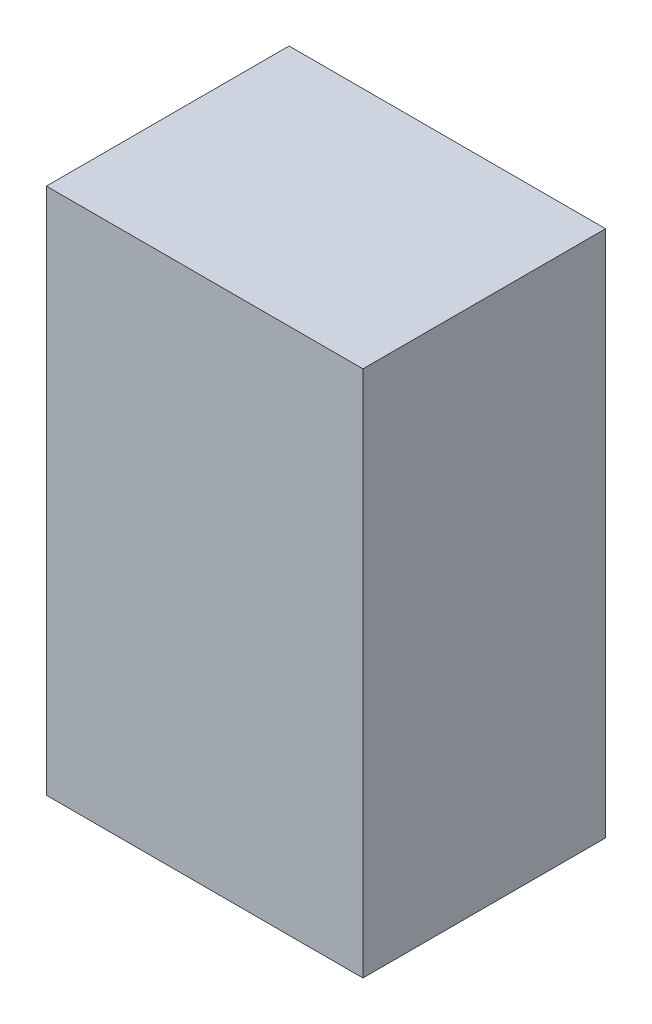
ISO-10303-21;
HEADER;
FILE_DESCRIPTION(('STEP AP214'),'2;1');
FILE_NAME('part.step','',(''),(''),'','','');
FILE_SCHEMA(('AUTOMOTIVE_DESIGN { 1 0 10303 214 1 1 1 1 }'));
ENDSEC;
DATA;
#1=APPLICATION_CONTEXT('core data for automotive mechanical design processes');
#2=APPLICATION_PROTOCOL_DEFINITION('international standard','automotive_design',2000,#1);
#3=PRODUCT_CONTEXT('',#1,'mechanical');
#4=PRODUCT('Part','Part','',(#3));
#5=PRODUCT_RELATED_PRODUCT_CATEGORY('part','',(#4));
#6=PRODUCT_DEFINITION_FORMATION('','',#4);
#7=PRODUCT_DEFINITION_CONTEXT('part definition',#1,'design');
#8=PRODUCT_DEFINITION('design','',#6,#7);
#9=PRODUCT_DEFINITION_SHAPE('','',#8);
#10=(LENGTH_UNIT() NAMED_UNIT(*) SI_UNIT(.MILLI.,.METRE.));
#11=(NAMED_UNIT(*) PLANE_ANGLE_UNIT() SI_UNIT($,.RADIAN.));
#12=(NAMED_UNIT(*) SI_UNIT($,.STERADIAN.) SOLID_ANGLE_UNIT());
#13=UNCERTAINTY_MEASURE_WITH_UNIT(LENGTH_MEASURE(1.E-05),#10,'distance_accuracy_value','');
#14=(GEOMETRIC_REPRESENTATION_CONTEXT(3) GLOBAL_UNCERTAINTY_ASSIGNED_CONTEXT((#13)) GLOBAL_UNIT_ASSIGNED_CONTEXT((#10,
#11,#12)) REPRESENTATION_CONTEXT('',''));
#15=CARTESIAN_POINT('',(0.,0.,0.));
#16=DIRECTION('',(0.,0.,1.));
#17=DIRECTION('',(1.,0.,0.));
#18=AXIS2_PLACEMENT_3D('',#15,#16,#17);
#19=CARTESIAN_POINT('',(0.,25.,0.));
#20=DIRECTION('',(0.,1.,0.));
#21=DIRECTION('',(0.,0.,1.));
#22=AXIS2_PLACEMENT_3D('',#19,#20,#21);
#23=PLANE('',#22);
#24=DIRECTION('',(0.,0.,-1.));
#25=VECTOR('',#24,1.);
#26=CARTESIAN_POINT('',(12.5,25.,0.));
#27=LINE('',#26,#25);
#28=CARTESIAN_POINT('',(12.5,25.,3.99999999999999));
#29=VERTEX_POINT('',#28);
#30=CARTESIAN_POINT('',(12.5,25.,-9.));
#31=VERTEX_POINT('',#30);
#32=EDGE_CURVE('E145',#29,#31,#27,.T.);
#33=ORIENTED_EDGE('',*,*,#32,.F.);
#34=DIRECTION('',(-1.,0.,0.));
#35=VECTOR('',#34,1.);
#36=CARTESIAN_POINT('',(12.5,25.,3.99999999999999));
#37=LINE('',#36,#35);
#38=CARTESIAN_POINT('',(1.5,25.,3.99999999999999));
#39=VERTEX_POINT('',#38);
#40=EDGE_CURVE('E150',#29,#39,#37,.T.);
#41=ORIENTED_EDGE('',*,*,#40,.T.);
#42=CARTESIAN_POINT('',(0.,25.,6.));
#43=DIRECTION('',(0.,1.,0.));
#44=DIRECTION('',(0.,0.,1.));
#45=AXIS2_PLACEMENT_3D('',#42,#43,#44);
#46=CIRCLE('',#45,2.5);
#47=CARTESIAN_POINT('',(-1.5,25.,3.99999999999999));
#48=VERTEX_POINT('',#47);
#49=EDGE_CURVE('E164',#48,#39,#46,.F.);
#50=ORIENTED_EDGE('',*,*,#49,.F.);
#51=CARTESIAN_POINT('',(-12.5,25.,4.));
#52=VERTEX_POINT('',#51);
#53=EDGE_CURVE('E158',#48,#52,#37,.T.);
#54=ORIENTED_EDGE('',*,*,#53,.T.);
#55=DIRECTION('',(0.,0.,-1.));
#56=VECTOR('',#55,1.);
#57=CARTESIAN_POINT('',(-12.5,25.,0.));
#58=LINE('',#57,#56);
#59=CARTESIAN_POINT('',(-12.5,25.,-9.));
#60=VERTEX_POINT('',#59);
#61=EDGE_CURVE('E54',#52,#60,#58,.T.);
#62=ORIENTED_EDGE('',*,*,#61,.T.);
#63=DIRECTION('',(1.,0.,0.));
#64=VECTOR('',#63,1.);
#65=CARTESIAN_POINT('',(0.,25.,-9.));
#66=LINE('',#65,#64);
#67=EDGE_CURVE('E160',#60,#31,#66,.T.);
#68=ORIENTED_EDGE('',*,*,#67,.T.);
#69=EDGE_LOOP('',(#33,#41,#50,#54,#62,#68));
#70=FACE_BOUND('',#69,.T.);
#71=ADVANCED_FACE('F39',(#70),#23,.F.);
#72=CARTESIAN_POINT('',(0.,2.5,0.));
#73=DIRECTION('',(0.,1.,0.));
#74=DIRECTION('',(0.,0.,1.));
#75=AXIS2_PLACEMENT_3D('',#72,#73,#74);
#76=PLANE('',#75);
#77=CARTESIAN_POINT('',(0.,2.5,6.));
#78=DIRECTION('',(0.,1.,0.));
#79=DIRECTION('',(0.,0.,1.));
#80=AXIS2_PLACEMENT_3D('',#77,#78,#79);
#81=CIRCLE('',#80,2.5);
#82=CARTESIAN_POINT('',(0.,2.5,8.5));
#83=VERTEX_POINT('',#82);
#84=EDGE_CURVE('E232',#83,#83,#81,.F.);
#85=ORIENTED_EDGE('',*,*,#84,.T.);
#86=EDGE_LOOP('',(#85));
#87=FACE_BOUND('',#86,.T.);
#88=DIRECTION('',(0.,0.,-1.));
#89=VECTOR('',#88,1.);
#90=CARTESIAN_POINT('',(-12.5,2.5,0.));
#91=LINE('',#90,#89);
#92=CARTESIAN_POINT('',(-12.5,2.5,9.));
#93=VERTEX_POINT('',#92);
#94=CARTESIAN_POINT('',(-12.5,2.5,-9.));
#95=VERTEX_POINT('',#94);
#96=EDGE_CURVE('E180',#93,#95,#91,.T.);
#97=ORIENTED_EDGE('',*,*,#96,.F.);
#98=DIRECTION('',(1.,0.,0.));
#99=VECTOR('',#98,1.);
#100=CARTESIAN_POINT('',(0.,2.5,9.));
#101=LINE('',#100,#99);
#102=CARTESIAN_POINT('',(12.5,2.5,9.));
#103=VERTEX_POINT('',#102);
#104=EDGE_CURVE('E183',#93,#103,#101,.T.);
#105=ORIENTED_EDGE('',*,*,#104,.T.);
#106=DIRECTION('',(0.,0.,-1.));
#107=VECTOR('',#106,1.);
#108=CARTESIAN_POINT('',(12.5,2.5,0.));
#109=LINE('',#108,#107);
#110=CARTESIAN_POINT('',(12.5,2.5,-9.));
#111=VERTEX_POINT('',#110);
#112=EDGE_CURVE('E187',#103,#111,#109,.T.);
#113=ORIENTED_EDGE('',*,*,#112,.T.);
#114=DIRECTION('',(1.,0.,0.));
#115=VECTOR('',#114,1.);
#116=CARTESIAN_POINT('',(0.,2.5,-9.));
#117=LINE('',#116,#115);
#118=EDGE_CURVE('E172',#95,#111,#117,.T.);
#119=ORIENTED_EDGE('',*,*,#118,.F.);
#120=EDGE_LOOP('',(#97,#105,#113,#119));
#121=FACE_BOUND('',#120,.T.);
#122=ADVANCED_FACE('F278',(#87,#121),#76,.T.);
#123=CARTESIAN_POINT('',(0.,47.5,-9.));
#124=DIRECTION('',(0.,0.,-1.));
#125=DIRECTION('',(-1.,0.,0.));
#126=AXIS2_PLACEMENT_3D('',#123,#124,#125);
#127=PLANE('',#126);
#128=ORIENTED_EDGE('',*,*,#67,.F.);
#129=DIRECTION('',(0.,-1.,0.));
#130=VECTOR('',#129,1.);
#131=CARTESIAN_POINT('',(-12.5,47.5,-9.));
#132=LINE('',#131,#130);
#133=EDGE_CURVE('E179',#60,#95,#132,.T.);
#134=ORIENTED_EDGE('',*,*,#133,.T.);
#135=ORIENTED_EDGE('',*,*,#118,.T.);
#136=DIRECTION('',(0.,-1.,0.));
#137=VECTOR('',#136,1.);
#138=CARTESIAN_POINT('',(12.5,47.5,-9.));
#139=LINE('',#138,#137);
#140=EDGE_CURVE('E195',#31,#111,#139,.T.);
#141=ORIENTED_EDGE('',*,*,#140,.F.);
#142=EDGE_LOOP('',(#128,#134,#135,#141));
#143=FACE_BOUND('',#142,.T.);
#144=ADVANCED_FACE('F276',(#143),#127,.F.);
#145=CARTESIAN_POINT('',(0.,-7.07106781186548,6.));
#146=DIRECTION('',(0.,1.,0.));
#147=DIRECTION('',(0.,0.,1.));
#148=AXIS2_PLACEMENT_3D('',#145,#146,#147);
#149=CYLINDRICAL_SURFACE('',#148,2.5);
#150=DIRECTION('',(0.,1.,0.));
#151=VECTOR('',#150,1.);
#152=CARTESIAN_POINT('',(-1.5,-7.07106781186548,3.99999999999999));
#153=LINE('',#152,#151);
#154=CARTESIAN_POINT('',(-1.5,26.,3.99999999999999));
#155=VERTEX_POINT('',#154);
#156=EDGE_CURVE('E239',#48,#155,#153,.T.);
#157=ORIENTED_EDGE('',*,*,#156,.F.);
#158=ORIENTED_EDGE('',*,*,#49,.T.);
#159=DIRECTION('',(0.,1.,0.));
#160=VECTOR('',#159,1.);
#161=CARTESIAN_POINT('',(1.5,-7.07106781186548,3.99999999999999));
#162=LINE('',#161,#160);
#163=CARTESIAN_POINT('',(1.5,26.,3.99999999999999));
#164=VERTEX_POINT('',#163);
#165=EDGE_CURVE('E155',#164,#39,#162,.F.);
#166=ORIENTED_EDGE('',*,*,#165,.F.);
#167=CARTESIAN_POINT('',(0.,26.,6.));
#168=DIRECTION('',(0.,1.,0.));
#169=DIRECTION('',(0.,0.,1.));
#170=AXIS2_PLACEMENT_3D('',#167,#168,#169);
#171=CIRCLE('',#170,2.5);
#172=EDGE_CURVE('E230',#155,#164,#171,.F.);
#173=ORIENTED_EDGE('',*,*,#172,.F.);
#174=EDGE_LOOP('',(#157,#158,#166,#173));
#175=FACE_BOUND('',#174,.T.);
#176=ADVANCED_FACE('F268',(#175),#149,.F.);
#177=ORIENTED_EDGE('',*,*,#84,.F.);
#178=EDGE_LOOP('',(#177));
#179=FACE_BOUND('',#178,.T.);
#180=CARTESIAN_POINT('',(0.,0.,6.));
#181=DIRECTION('',(0.,-1.,0.));
#182=DIRECTION('',(0.,0.,-1.));
#183=AXIS2_PLACEMENT_3D('',#180,#181,#182);
#184=CIRCLE('',#183,2.5);
#185=CARTESIAN_POINT('',(0.,0.,3.5));
#186=VERTEX_POINT('',#185);
#187=EDGE_CURVE('E233',#186,#186,#184,.T.);
#188=ORIENTED_EDGE('',*,*,#187,.T.);
#189=EDGE_LOOP('',(#188));
#190=FACE_BOUND('',#189,.T.);
#191=ADVANCED_FACE('F309',(#179,#190),#149,.F.);
#192=CARTESIAN_POINT('',(-15.,50.,11.5));
#193=DIRECTION('',(-1.,0.,0.));
#194=DIRECTION('',(0.,0.,1.));
#195=AXIS2_PLACEMENT_3D('',#192,#193,#194);
#196=PLANE('',#195);
#197=DIRECTION('',(0.,0.,-1.));
#198=VECTOR('',#197,1.);
#199=CARTESIAN_POINT('',(-15.,0.,11.5));
#200=LINE('',#199,#198);
#201=CARTESIAN_POINT('',(-15.,0.,11.5));
#202=VERTEX_POINT('',#201);
#203=CARTESIAN_POINT('',(-15.,0.,-11.5));
#204=VERTEX_POINT('',#203);
#205=EDGE_CURVE('E202',#202,#204,#200,.T.);
#206=ORIENTED_EDGE('',*,*,#205,.F.);
#207=DIRECTION('',(0.,-1.,0.));
#208=VECTOR('',#207,1.);
#209=CARTESIAN_POINT('',(-15.,50.,11.5));
#210=LINE('',#209,#208);
#211=CARTESIAN_POINT('',(-15.,50.,11.5));
#212=VERTEX_POINT('',#211);
#213=EDGE_CURVE('E47',#212,#202,#210,.T.);
#214=ORIENTED_EDGE('',*,*,#213,.F.);
#215=DIRECTION('',(0.,0.,-1.));
#216=VECTOR('',#215,1.);
#217=CARTESIAN_POINT('',(-15.,50.,11.5));
#218=LINE('',#217,#216);
#219=CARTESIAN_POINT('',(-15.,50.,-11.5));
#220=VERTEX_POINT('',#219);
#221=EDGE_CURVE('E203',#212,#220,#218,.T.);
#222=ORIENTED_EDGE('',*,*,#221,.T.);
#223=DIRECTION('',(0.,-1.,0.));
#224=VECTOR('',#223,1.);
#225=CARTESIAN_POINT('',(-15.,50.,-11.5));
#226=LINE('',#225,#224);
#227=EDGE_CURVE('E214',#220,#204,#226,.T.);
#228=ORIENTED_EDGE('',*,*,#227,.T.);
#229=EDGE_LOOP('',(#206,#214,#222,#228));
#230=FACE_BOUND('',#229,.T.);
#231=ADVANCED_FACE('F41',(#230),#196,.T.);
#232=CARTESIAN_POINT('',(-15.,50.,11.5));
#233=DIRECTION('',(0.,0.,-1.));
#234=DIRECTION('',(-1.,0.,0.));
#235=AXIS2_PLACEMENT_3D('',#232,#233,#234);
#236=PLANE('',#235);
#237=DIRECTION('',(1.,0.,0.));
#238=VECTOR('',#237,1.);
#239=CARTESIAN_POINT('',(-15.,0.,11.5));
#240=LINE('',#239,#238);
#241=CARTESIAN_POINT('',(15.,0.,11.5));
#242=VERTEX_POINT('',#241);
#243=EDGE_CURVE('E207',#202,#242,#240,.T.);
#244=ORIENTED_EDGE('',*,*,#243,.T.);
#245=DIRECTION('',(0.,-1.,0.));
#246=VECTOR('',#245,1.);
#247=CARTESIAN_POINT('',(15.,50.,11.5));
#248=LINE('',#247,#246);
#249=CARTESIAN_POINT('',(15.,50.,11.5));
#250=VERTEX_POINT('',#249);
#251=EDGE_CURVE('E225',#250,#242,#248,.T.);
#252=ORIENTED_EDGE('',*,*,#251,.F.);
#253=DIRECTION('',(1.,0.,0.));
#254=VECTOR('',#253,1.);
#255=CARTESIAN_POINT('',(-15.,50.,11.5));
#256=LINE('',#255,#254);
#257=EDGE_CURVE('E212',#212,#250,#256,.T.);
#258=ORIENTED_EDGE('',*,*,#257,.F.);
#259=ORIENTED_EDGE('',*,*,#213,.T.);
#260=EDGE_LOOP('',(#244,#252,#258,#259));
#261=FACE_BOUND('',#260,.T.);
#262=ADVANCED_FACE('F399',(#261),#236,.F.);
#263=CARTESIAN_POINT('',(15.,50.,11.5));
#264=DIRECTION('',(-1.,0.,0.));
#265=DIRECTION('',(0.,0.,1.));
#266=AXIS2_PLACEMENT_3D('',#263,#264,#265);
#267=PLANE('',#266);
#268=DIRECTION('',(0.,0.,-1.));
#269=VECTOR('',#268,1.);
#270=CARTESIAN_POINT('',(15.,0.,11.5));
#271=LINE('',#270,#269);
#272=CARTESIAN_POINT('',(15.,0.,-11.5));
#273=VERTEX_POINT('',#272);
#274=EDGE_CURVE('E220',#242,#273,#271,.T.);
#275=ORIENTED_EDGE('',*,*,#274,.T.);
#276=DIRECTION('',(0.,-1.,0.));
#277=VECTOR('',#276,1.);
#278=CARTESIAN_POINT('',(15.,50.,-11.5));
#279=LINE('',#278,#277);
#280=CARTESIAN_POINT('',(15.,50.,-11.5));
#281=VERTEX_POINT('',#280);
#282=EDGE_CURVE('E228',#281,#273,#279,.T.);
#283=ORIENTED_EDGE('',*,*,#282,.F.);
#284=DIRECTION('',(0.,0.,-1.));
#285=VECTOR('',#284,1.);
#286=CARTESIAN_POINT('',(15.,50.,11.5));
#287=LINE('',#286,#285);
#288=EDGE_CURVE('E210',#250,#281,#287,.T.);
#289=ORIENTED_EDGE('',*,*,#288,.F.);
#290=ORIENTED_EDGE('',*,*,#251,.T.);
#291=EDGE_LOOP('',(#275,#283,#289,#290));
#292=FACE_BOUND('',#291,.T.);
#293=ADVANCED_FACE('F406',(#292),#267,.F.);
#294=CARTESIAN_POINT('',(-15.,50.,-11.5));
#295=DIRECTION('',(0.,0.,-1.));
#296=DIRECTION('',(-1.,0.,0.));
#297=AXIS2_PLACEMENT_3D('',#294,#295,#296);
#298=PLANE('',#297);
#299=DIRECTION('',(1.,0.,0.));
#300=VECTOR('',#299,1.);
#301=CARTESIAN_POINT('',(-15.,0.,-11.5));
#302=LINE('',#301,#300);
#303=EDGE_CURVE('E217',#204,#273,#302,.T.);
#304=ORIENTED_EDGE('',*,*,#303,.F.);
#305=ORIENTED_EDGE('',*,*,#227,.F.);
#306=DIRECTION('',(1.,0.,0.));
#307=VECTOR('',#306,1.);
#308=CARTESIAN_POINT('',(-15.,50.,-11.5));
#309=LINE('',#308,#307);
#310=EDGE_CURVE('E206',#220,#281,#309,.T.);
#311=ORIENTED_EDGE('',*,*,#310,.T.);
#312=ORIENTED_EDGE('',*,*,#282,.T.);
#313=EDGE_LOOP('',(#304,#305,#311,#312));
#314=FACE_BOUND('',#313,.T.);
#315=ADVANCED_FACE('F414',(#314),#298,.T.);
#316=CARTESIAN_POINT('',(0.,50.,0.));
#317=DIRECTION('',(0.,-1.,0.));
#318=DIRECTION('',(0.,0.,-1.));
#319=AXIS2_PLACEMENT_3D('',#316,#317,#318);
#320=PLANE('',#319);
#321=ORIENTED_EDGE('',*,*,#221,.F.);
#322=ORIENTED_EDGE('',*,*,#257,.T.);
#323=ORIENTED_EDGE('',*,*,#288,.T.);
#324=ORIENTED_EDGE('',*,*,#310,.F.);
#325=EDGE_LOOP('',(#321,#322,#323,#324));
#326=FACE_BOUND('',#325,.T.);
#327=ADVANCED_FACE('F422',(#326),#320,.F.);
#328=CARTESIAN_POINT('',(0.,0.,0.));
#329=DIRECTION('',(0.,-1.,0.));
#330=DIRECTION('',(0.,0.,-1.));
#331=AXIS2_PLACEMENT_3D('',#328,#329,#330);
#332=PLANE('',#331);
#333=ORIENTED_EDGE('',*,*,#187,.F.);
#334=EDGE_LOOP('',(#333));
#335=FACE_BOUND('',#334,.T.);
#336=ORIENTED_EDGE('',*,*,#205,.T.);
#337=ORIENTED_EDGE('',*,*,#303,.T.);
#338=ORIENTED_EDGE('',*,*,#274,.F.);
#339=ORIENTED_EDGE('',*,*,#243,.F.);
#340=EDGE_LOOP('',(#336,#337,#338,#339));
#341=FACE_BOUND('',#340,.T.);
#342=ADVANCED_FACE('F288',(#335,#341),#332,.T.);
#343=CARTESIAN_POINT('',(-12.5,47.5,0.));
#344=DIRECTION('',(-1.,0.,0.));
#345=DIRECTION('',(0.,0.,1.));
#346=AXIS2_PLACEMENT_3D('',#343,#344,#345);
#347=PLANE('',#346);
#348=DIRECTION('',(0.,-1.,0.));
#349=VECTOR('',#348,1.);
#350=CARTESIAN_POINT('',(-12.5,47.5,9.));
#351=LINE('',#350,#349);
#352=CARTESIAN_POINT('',(-12.5,47.5,9.));
#353=VERTEX_POINT('',#352);
#354=EDGE_CURVE('E200',#353,#93,#351,.T.);
#355=ORIENTED_EDGE('',*,*,#354,.T.);
#356=ORIENTED_EDGE('',*,*,#96,.T.);
#357=ORIENTED_EDGE('',*,*,#133,.F.);
#358=ORIENTED_EDGE('',*,*,#61,.F.);
#359=DIRECTION('',(0.,1.,0.));
#360=VECTOR('',#359,1.);
#361=CARTESIAN_POINT('',(-12.5,25.,4.));
#362=LINE('',#361,#360);
#363=CARTESIAN_POINT('',(-12.5,26.,4.));
#364=VERTEX_POINT('',#363);
#365=EDGE_CURVE('E149',#52,#364,#362,.T.);
#366=ORIENTED_EDGE('',*,*,#365,.T.);
#367=DIRECTION('',(0.,0.,-1.));
#368=VECTOR('',#367,1.);
#369=CARTESIAN_POINT('',(-12.5,26.,0.));
#370=LINE('',#369,#368);
#371=CARTESIAN_POINT('',(-12.5,26.,-9.));
#372=VERTEX_POINT('',#371);
#373=EDGE_CURVE('E162',#364,#372,#370,.T.);
#374=ORIENTED_EDGE('',*,*,#373,.T.);
#375=CARTESIAN_POINT('',(-12.5,47.5,-9.));
#376=VERTEX_POINT('',#375);
#377=EDGE_CURVE('E192',#376,#372,#132,.T.);
#378=ORIENTED_EDGE('',*,*,#377,.F.);
#379=DIRECTION('',(0.,0.,-1.));
#380=VECTOR('',#379,1.);
#381=CARTESIAN_POINT('',(-12.5,47.5,0.));
#382=LINE('',#381,#380);
#383=EDGE_CURVE('E168',#353,#376,#382,.T.);
#384=ORIENTED_EDGE('',*,*,#383,.F.);
#385=EDGE_LOOP('',(#355,#356,#357,#358,#366,#374,#378,#384));
#386=FACE_BOUND('',#385,.T.);
#387=ADVANCED_FACE('F261',(#386),#347,.F.);
#388=CARTESIAN_POINT('',(0.,47.5,9.));
#389=DIRECTION('',(0.,0.,-1.));
#390=DIRECTION('',(-1.,0.,0.));
#391=AXIS2_PLACEMENT_3D('',#388,#389,#390);
#392=PLANE('',#391);
#393=DIRECTION('',(0.,-1.,0.));
#394=VECTOR('',#393,1.);
#395=CARTESIAN_POINT('',(12.5,47.5,9.));
#396=LINE('',#395,#394);
#397=CARTESIAN_POINT('',(12.5,47.5,9.));
#398=VERTEX_POINT('',#397);
#399=EDGE_CURVE('E198',#398,#103,#396,.T.);
#400=ORIENTED_EDGE('',*,*,#399,.T.);
#401=ORIENTED_EDGE('',*,*,#104,.F.);
#402=ORIENTED_EDGE('',*,*,#354,.F.);
#403=DIRECTION('',(1.,0.,0.));
#404=VECTOR('',#403,1.);
#405=CARTESIAN_POINT('',(0.,47.5,9.));
#406=LINE('',#405,#404);
#407=EDGE_CURVE('E171',#353,#398,#406,.T.);
#408=ORIENTED_EDGE('',*,*,#407,.T.);
#409=EDGE_LOOP('',(#400,#401,#402,#408));
#410=FACE_BOUND('',#409,.T.);
#411=ADVANCED_FACE('F280',(#410),#392,.T.);
#412=CARTESIAN_POINT('',(12.5,47.5,0.));
#413=DIRECTION('',(-1.,0.,0.));
#414=DIRECTION('',(0.,0.,1.));
#415=AXIS2_PLACEMENT_3D('',#412,#413,#414);
#416=PLANE('',#415);
#417=DIRECTION('',(0.,0.,-1.));
#418=VECTOR('',#417,1.);
#419=CARTESIAN_POINT('',(12.5,26.,0.));
#420=LINE('',#419,#418);
#421=CARTESIAN_POINT('',(12.5,26.,3.99999999999999));
#422=VERTEX_POINT('',#421);
#423=CARTESIAN_POINT('',(12.5,26.,-9.));
#424=VERTEX_POINT('',#423);
#425=EDGE_CURVE('E62',#422,#424,#420,.T.);
#426=ORIENTED_EDGE('',*,*,#425,.F.);
#427=DIRECTION('',(0.,1.,0.));
#428=VECTOR('',#427,1.);
#429=CARTESIAN_POINT('',(12.5,25.,3.99999999999999));
#430=LINE('',#429,#428);
#431=EDGE_CURVE('E141',#29,#422,#430,.T.);
#432=ORIENTED_EDGE('',*,*,#431,.F.);
#433=ORIENTED_EDGE('',*,*,#32,.T.);
#434=ORIENTED_EDGE('',*,*,#140,.T.);
#435=ORIENTED_EDGE('',*,*,#112,.F.);
#436=ORIENTED_EDGE('',*,*,#399,.F.);
#437=DIRECTION('',(0.,0.,-1.));
#438=VECTOR('',#437,1.);
#439=CARTESIAN_POINT('',(12.5,47.5,0.));
#440=LINE('',#439,#438);
#441=CARTESIAN_POINT('',(12.5,47.5,-9.));
#442=VERTEX_POINT('',#441);
#443=EDGE_CURVE('E174',#398,#442,#440,.T.);
#444=ORIENTED_EDGE('',*,*,#443,.T.);
#445=EDGE_CURVE('E196',#442,#424,#139,.T.);
#446=ORIENTED_EDGE('',*,*,#445,.T.);
#447=EDGE_LOOP('',(#426,#432,#433,#434,#435,#436,#444,#446));
#448=FACE_BOUND('',#447,.T.);
#449=ADVANCED_FACE('F143',(#448),#416,.T.);
#450=ORIENTED_EDGE('',*,*,#377,.T.);
#451=DIRECTION('',(1.,0.,0.));
#452=VECTOR('',#451,1.);
#453=CARTESIAN_POINT('',(0.,26.,-9.));
#454=LINE('',#453,#452);
#455=EDGE_CURVE('E184',#372,#424,#454,.T.);
#456=ORIENTED_EDGE('',*,*,#455,.T.);
#457=ORIENTED_EDGE('',*,*,#445,.F.);
#458=DIRECTION('',(1.,0.,0.));
#459=VECTOR('',#458,1.);
#460=CARTESIAN_POINT('',(0.,47.5,-9.));
#461=LINE('',#460,#459);
#462=EDGE_CURVE('E176',#376,#442,#461,.T.);
#463=ORIENTED_EDGE('',*,*,#462,.F.);
#464=EDGE_LOOP('',(#450,#456,#457,#463));
#465=FACE_BOUND('',#464,.T.);
#466=ADVANCED_FACE('F250',(#465),#127,.F.);
#467=CARTESIAN_POINT('',(0.,47.5,0.));
#468=DIRECTION('',(0.,1.,0.));
#469=DIRECTION('',(0.,0.,1.));
#470=AXIS2_PLACEMENT_3D('',#467,#468,#469);
#471=PLANE('',#470);
#472=ORIENTED_EDGE('',*,*,#383,.T.);
#473=ORIENTED_EDGE('',*,*,#462,.T.);
#474=ORIENTED_EDGE('',*,*,#443,.F.);
#475=ORIENTED_EDGE('',*,*,#407,.F.);
#476=EDGE_LOOP('',(#472,#473,#474,#475));
#477=FACE_BOUND('',#476,.T.);
#478=ADVANCED_FACE('F258',(#477),#471,.F.);
#479=CARTESIAN_POINT('',(0.,26.,0.));
#480=DIRECTION('',(0.,1.,0.));
#481=DIRECTION('',(0.,0.,1.));
#482=AXIS2_PLACEMENT_3D('',#479,#480,#481);
#483=PLANE('',#482);
#484=DIRECTION('',(-1.,0.,0.));
#485=VECTOR('',#484,1.);
#486=CARTESIAN_POINT('',(12.5,26.,3.99999999999999));
#487=LINE('',#486,#485);
#488=EDGE_CURVE('E271',#422,#164,#487,.T.);
#489=ORIENTED_EDGE('',*,*,#488,.F.);
#490=ORIENTED_EDGE('',*,*,#425,.T.);
#491=ORIENTED_EDGE('',*,*,#455,.F.);
#492=ORIENTED_EDGE('',*,*,#373,.F.);
#493=DIRECTION('',(-1.,0.,0.));
#494=VECTOR('',#493,1.);
#495=CARTESIAN_POINT('',(0.,26.,3.99999999999999));
#496=LINE('',#495,#494);
#497=EDGE_CURVE('E11',#155,#364,#496,.T.);
#498=ORIENTED_EDGE('',*,*,#497,.F.);
#499=ORIENTED_EDGE('',*,*,#172,.T.);
#500=EDGE_LOOP('',(#489,#490,#491,#492,#498,#499));
#501=FACE_BOUND('',#500,.T.);
#502=ADVANCED_FACE('F264',(#501),#483,.T.);
#503=CARTESIAN_POINT('',(12.5,25.,3.99999999999999));
#504=DIRECTION('',(0.,0.,-1.));
#505=DIRECTION('',(-1.,0.,0.));
#506=AXIS2_PLACEMENT_3D('',#503,#504,#505);
#507=PLANE('',#506);
#508=ORIENTED_EDGE('',*,*,#156,.T.);
#509=ORIENTED_EDGE('',*,*,#497,.T.);
#510=ORIENTED_EDGE('',*,*,#365,.F.);
#511=ORIENTED_EDGE('',*,*,#53,.F.);
#512=EDGE_LOOP('',(#508,#509,#510,#511));
#513=FACE_BOUND('',#512,.T.);
#514=ADVANCED_FACE('F316',(#513),#507,.F.);
#515=ORIENTED_EDGE('',*,*,#165,.T.);
#516=ORIENTED_EDGE('',*,*,#40,.F.);
#517=ORIENTED_EDGE('',*,*,#431,.T.);
#518=ORIENTED_EDGE('',*,*,#488,.T.);
#519=EDGE_LOOP('',(#515,#516,#517,#518));
#520=FACE_BOUND('',#519,.T.);
#521=ADVANCED_FACE('F153',(#520),#507,.F.);
#522=CLOSED_SHELL('',(#71,#122,#144,#176,#191,#231,#262,#293,#315,#327,#342,#387,#411,#449,#466,
#478,#502,#514,#521));
#523=MANIFOLD_SOLID_BREP('B2',#522);
#524=ADVANCED_BREP_SHAPE_REPRESENTATION('',(#18,#523),#14);
#525=SHAPE_DEFINITION_REPRESENTATION(#9,#524);
ENDSEC;
END-ISO-10303-21;
